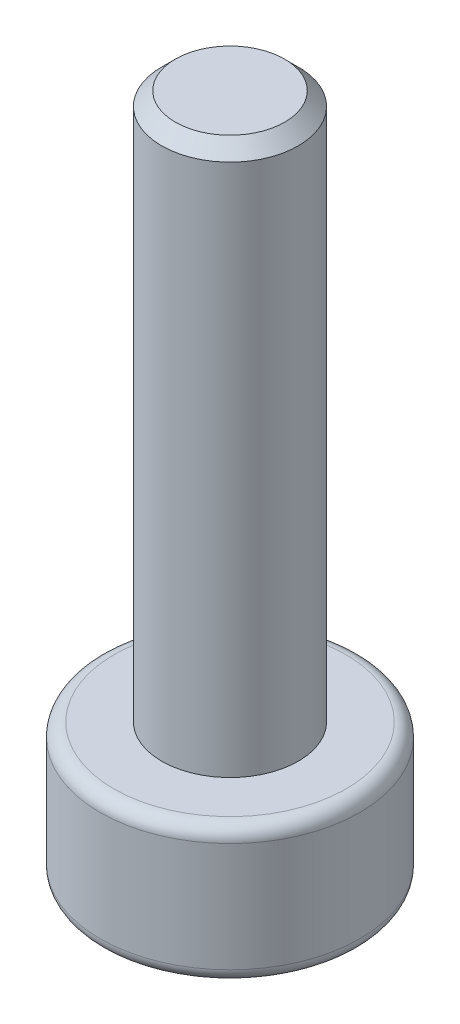
ISO-10303-21;
HEADER;
FILE_DESCRIPTION(('STEP AP214'),'2;1');
FILE_NAME('part.step','',(''),(''),'','','');
FILE_SCHEMA(('AUTOMOTIVE_DESIGN { 1 0 10303 214 1 1 1 1 }'));
ENDSEC;
DATA;
#1=APPLICATION_CONTEXT('core data for automotive mechanical design processes');
#2=APPLICATION_PROTOCOL_DEFINITION('international standard','automotive_design',2000,#1);
#3=PRODUCT_CONTEXT('',#1,'mechanical');
#4=PRODUCT('Part','Part','',(#3));
#5=PRODUCT_RELATED_PRODUCT_CATEGORY('part','',(#4));
#6=PRODUCT_DEFINITION_FORMATION('','',#4);
#7=PRODUCT_DEFINITION_CONTEXT('part definition',#1,'design');
#8=PRODUCT_DEFINITION('design','',#6,#7);
#9=PRODUCT_DEFINITION_SHAPE('','',#8);
#10=(LENGTH_UNIT() NAMED_UNIT(*) SI_UNIT(.MILLI.,.METRE.));
#11=(NAMED_UNIT(*) PLANE_ANGLE_UNIT() SI_UNIT($,.RADIAN.));
#12=(NAMED_UNIT(*) SI_UNIT($,.STERADIAN.) SOLID_ANGLE_UNIT());
#13=UNCERTAINTY_MEASURE_WITH_UNIT(LENGTH_MEASURE(1.E-05),#10,'distance_accuracy_value','');
#14=(GEOMETRIC_REPRESENTATION_CONTEXT(3) GLOBAL_UNCERTAINTY_ASSIGNED_CONTEXT((#13)) GLOBAL_UNIT_ASSIGNED_CONTEXT((#10,
#11,#12)) REPRESENTATION_CONTEXT('',''));
#15=CARTESIAN_POINT('',(0.,0.,0.));
#16=DIRECTION('',(0.,0.,1.));
#17=DIRECTION('',(1.,0.,0.));
#18=AXIS2_PLACEMENT_3D('',#15,#16,#17);
#19=CARTESIAN_POINT('',(0.,3.,0.));
#20=DIRECTION('',(0.,-1.,0.));
#21=DIRECTION('',(0.,0.,-1.));
#22=AXIS2_PLACEMENT_3D('',#19,#20,#21);
#23=CYLINDRICAL_SURFACE('',#22,2.85);
#24=CARTESIAN_POINT('',(0.,2.7,0.));
#25=DIRECTION('',(0.,1.,0.));
#26=DIRECTION('',(0.,0.,1.));
#27=AXIS2_PLACEMENT_3D('',#24,#25,#26);
#28=CIRCLE('',#27,2.85);
#29=CARTESIAN_POINT('',(0.,2.7,2.85));
#30=VERTEX_POINT('',#29);
#31=EDGE_CURVE('E68',#30,#30,#28,.F.);
#32=ORIENTED_EDGE('',*,*,#31,.T.);
#33=EDGE_LOOP('',(#32));
#34=FACE_BOUND('',#33,.T.);
#35=CARTESIAN_POINT('',(0.,0.3,0.));
#36=DIRECTION('',(0.,1.,0.));
#37=DIRECTION('',(0.,0.,1.));
#38=AXIS2_PLACEMENT_3D('',#35,#36,#37);
#39=CIRCLE('',#38,2.85);
#40=CARTESIAN_POINT('',(0.,0.3,2.85));
#41=VERTEX_POINT('',#40);
#42=EDGE_CURVE('E72',#41,#41,#39,.T.);
#43=ORIENTED_EDGE('',*,*,#42,.T.);
#44=EDGE_LOOP('',(#43));
#45=FACE_BOUND('',#44,.T.);
#46=ADVANCED_FACE('F39',(#34,#45),#23,.T.);
#47=CARTESIAN_POINT('',(0.,3.,0.));
#48=DIRECTION('',(0.,1.,0.));
#49=DIRECTION('',(0.,0.,1.));
#50=AXIS2_PLACEMENT_3D('',#47,#48,#49);
#51=PLANE('',#50);
#52=CARTESIAN_POINT('',(0.,3.,0.));
#53=DIRECTION('',(0.,1.,0.));
#54=DIRECTION('',(0.,0.,1.));
#55=AXIS2_PLACEMENT_3D('',#52,#53,#54);
#56=CIRCLE('',#55,2.55);
#57=CARTESIAN_POINT('',(0.,3.,2.55));
#58=VERTEX_POINT('',#57);
#59=EDGE_CURVE('E76',#58,#58,#56,.T.);
#60=ORIENTED_EDGE('',*,*,#59,.T.);
#61=EDGE_LOOP('',(#60));
#62=FACE_BOUND('',#61,.T.);
#63=CARTESIAN_POINT('',(0.,3.,0.));
#64=DIRECTION('',(0.,1.,0.));
#65=DIRECTION('',(0.,0.,1.));
#66=AXIS2_PLACEMENT_3D('',#63,#64,#65);
#67=CIRCLE('',#66,1.5);
#68=CARTESIAN_POINT('',(0.,3.,1.5));
#69=VERTEX_POINT('',#68);
#70=EDGE_CURVE('E80',#69,#69,#67,.T.);
#71=ORIENTED_EDGE('',*,*,#70,.F.);
#72=EDGE_LOOP('',(#71));
#73=FACE_BOUND('',#72,.T.);
#74=ADVANCED_FACE('F105',(#62,#73),#51,.T.);
#75=CARTESIAN_POINT('',(0.,0.,0.));
#76=DIRECTION('',(0.,1.,0.));
#77=DIRECTION('',(0.,0.,1.));
#78=AXIS2_PLACEMENT_3D('',#75,#76,#77);
#79=PLANE('',#78);
#80=CARTESIAN_POINT('',(0.,0.,0.));
#81=DIRECTION('',(0.,1.,0.));
#82=DIRECTION('',(0.,0.,1.));
#83=AXIS2_PLACEMENT_3D('',#80,#81,#82);
#84=CIRCLE('',#83,1.44);
#85=CARTESIAN_POINT('',(0.,0.,1.44));
#86=VERTEX_POINT('',#85);
#87=EDGE_CURVE('E10',#86,#86,#84,.T.);
#88=ORIENTED_EDGE('',*,*,#87,.T.);
#89=EDGE_LOOP('',(#88));
#90=FACE_BOUND('',#89,.T.);
#91=CARTESIAN_POINT('',(0.,0.,0.));
#92=DIRECTION('',(0.,1.,0.));
#93=DIRECTION('',(0.,0.,1.));
#94=AXIS2_PLACEMENT_3D('',#91,#92,#93);
#95=CIRCLE('',#94,2.55);
#96=CARTESIAN_POINT('',(0.,0.,2.55));
#97=VERTEX_POINT('',#96);
#98=EDGE_CURVE('E64',#97,#97,#95,.F.);
#99=ORIENTED_EDGE('',*,*,#98,.T.);
#100=EDGE_LOOP('',(#99));
#101=FACE_BOUND('',#100,.T.);
#102=ADVANCED_FACE('F111',(#90,#101),#79,.F.);
#103=CARTESIAN_POINT('',(0.,15.,0.));
#104=DIRECTION('',(0.,-1.,0.));
#105=DIRECTION('',(0.,0.,-1.));
#106=AXIS2_PLACEMENT_3D('',#103,#104,#105);
#107=CYLINDRICAL_SURFACE('',#106,1.5);
#108=CARTESIAN_POINT('',(0.,14.7,0.));
#109=DIRECTION('',(0.,1.,0.));
#110=DIRECTION('',(0.,0.,1.));
#111=AXIS2_PLACEMENT_3D('',#108,#109,#110);
#112=CIRCLE('',#111,1.5);
#113=CARTESIAN_POINT('',(0.,14.7,1.5));
#114=VERTEX_POINT('',#113);
#115=EDGE_CURVE('E53',#114,#114,#112,.F.);
#116=ORIENTED_EDGE('',*,*,#115,.T.);
#117=EDGE_LOOP('',(#116));
#118=FACE_BOUND('',#117,.T.);
#119=ORIENTED_EDGE('',*,*,#70,.T.);
#120=EDGE_LOOP('',(#119));
#121=FACE_BOUND('',#120,.T.);
#122=ADVANCED_FACE('F101',(#118,#121),#107,.T.);
#123=CARTESIAN_POINT('',(0.,15.,0.));
#124=DIRECTION('',(0.,1.,0.));
#125=DIRECTION('',(0.,0.,1.));
#126=AXIS2_PLACEMENT_3D('',#123,#124,#125);
#127=PLANE('',#126);
#128=CARTESIAN_POINT('',(0.,15.,0.));
#129=DIRECTION('',(0.,1.,0.));
#130=DIRECTION('',(0.,0.,1.));
#131=AXIS2_PLACEMENT_3D('',#128,#129,#130);
#132=CIRCLE('',#131,1.2);
#133=CARTESIAN_POINT('',(0.,15.,1.2));
#134=VERTEX_POINT('',#133);
#135=EDGE_CURVE('E58',#134,#134,#132,.T.);
#136=ORIENTED_EDGE('',*,*,#135,.T.);
#137=EDGE_LOOP('',(#136));
#138=FACE_BOUND('',#137,.T.);
#139=ADVANCED_FACE('F93',(#138),#127,.T.);
#140=CARTESIAN_POINT('',(0.,1.3,0.));
#141=DIRECTION('',(0.,-1.,0.));
#142=DIRECTION('',(0.,0.,-1.));
#143=AXIS2_PLACEMENT_3D('',#140,#141,#142);
#144=CYLINDRICAL_SURFACE('',#143,1.29);
#145=CARTESIAN_POINT('',(0.,0.149999999999998,0.));
#146=DIRECTION('',(0.,1.,0.));
#147=DIRECTION('',(0.,0.,1.));
#148=AXIS2_PLACEMENT_3D('',#145,#146,#147);
#149=CIRCLE('',#148,1.29);
#150=CARTESIAN_POINT('',(0.,0.149999999999998,1.29));
#151=VERTEX_POINT('',#150);
#152=EDGE_CURVE('E48',#151,#151,#149,.F.);
#153=ORIENTED_EDGE('',*,*,#152,.T.);
#154=EDGE_LOOP('',(#153));
#155=FACE_BOUND('',#154,.T.);
#156=CARTESIAN_POINT('',(0.,1.3,0.));
#157=DIRECTION('',(0.,-1.,0.));
#158=DIRECTION('',(0.,0.,-1.));
#159=AXIS2_PLACEMENT_3D('',#156,#157,#158);
#160=CIRCLE('',#159,1.29);
#161=CARTESIAN_POINT('',(0.,1.3,-1.29));
#162=VERTEX_POINT('',#161);
#163=EDGE_CURVE('E84',#162,#162,#160,.T.);
#164=ORIENTED_EDGE('',*,*,#163,.F.);
#165=EDGE_LOOP('',(#164));
#166=FACE_BOUND('',#165,.T.);
#167=ADVANCED_FACE('F91',(#155,#166),#144,.F.);
#168=CARTESIAN_POINT('',(0.,1.3,0.));
#169=DIRECTION('',(0.,-1.,0.));
#170=DIRECTION('',(0.,0.,-1.));
#171=AXIS2_PLACEMENT_3D('',#168,#169,#170);
#172=PLANE('',#171);
#173=ORIENTED_EDGE('',*,*,#163,.T.);
#174=EDGE_LOOP('',(#173));
#175=FACE_BOUND('',#174,.T.);
#176=ADVANCED_FACE('F89',(#175),#172,.T.);
#177=CARTESIAN_POINT('',(0.,2.7,0.));
#178=DIRECTION('',(0.,1.,0.));
#179=DIRECTION('',(0.,0.,1.));
#180=AXIS2_PLACEMENT_3D('',#177,#178,#179);
#181=TOROIDAL_SURFACE('',#180,2.55,0.3);
#182=ORIENTED_EDGE('',*,*,#31,.F.);
#183=EDGE_LOOP('',(#182));
#184=FACE_BOUND('',#183,.T.);
#185=ORIENTED_EDGE('',*,*,#59,.F.);
#186=EDGE_LOOP('',(#185));
#187=FACE_BOUND('',#186,.T.);
#188=ADVANCED_FACE('F99',(#184,#187),#181,.T.);
#189=CARTESIAN_POINT('',(0.,0.3,0.));
#190=DIRECTION('',(0.,1.,0.));
#191=DIRECTION('',(0.,0.,1.));
#192=AXIS2_PLACEMENT_3D('',#189,#190,#191);
#193=TOROIDAL_SURFACE('',#192,2.55,0.3);
#194=ORIENTED_EDGE('',*,*,#98,.F.);
#195=EDGE_LOOP('',(#194));
#196=FACE_BOUND('',#195,.T.);
#197=ORIENTED_EDGE('',*,*,#42,.F.);
#198=EDGE_LOOP('',(#197));
#199=FACE_BOUND('',#198,.T.);
#200=ADVANCED_FACE('F119',(#196,#199),#193,.T.);
#201=CARTESIAN_POINT('',(0.,15.,0.));
#202=DIRECTION('',(0.,-1.,0.));
#203=DIRECTION('',(0.,0.,-1.));
#204=AXIS2_PLACEMENT_3D('',#201,#202,#203);
#205=CONICAL_SURFACE('',#204,1.2,0.785398163397444);
#206=ORIENTED_EDGE('',*,*,#115,.F.);
#207=EDGE_LOOP('',(#206));
#208=FACE_BOUND('',#207,.T.);
#209=ORIENTED_EDGE('',*,*,#135,.F.);
#210=EDGE_LOOP('',(#209));
#211=FACE_BOUND('',#210,.T.);
#212=ADVANCED_FACE('F122',(#208,#211),#205,.T.);
#213=CARTESIAN_POINT('',(0.,0.149999999999998,0.));
#214=DIRECTION('',(0.,-1.,0.));
#215=DIRECTION('',(0.,0.,-1.));
#216=AXIS2_PLACEMENT_3D('',#213,#214,#215);
#217=CONICAL_SURFACE('',#216,1.29,0.78539816339745);
#218=ORIENTED_EDGE('',*,*,#87,.F.);
#219=EDGE_LOOP('',(#218));
#220=FACE_BOUND('',#219,.T.);
#221=ORIENTED_EDGE('',*,*,#152,.F.);
#222=EDGE_LOOP('',(#221));
#223=FACE_BOUND('',#222,.T.);
#224=ADVANCED_FACE('F42',(#220,#223),#217,.F.);
#225=CLOSED_SHELL('',(#46,#74,#102,#122,#139,#167,#176,#188,#200,#212,#224));
#226=MANIFOLD_SOLID_BREP('B2',#225);
#227=ADVANCED_BREP_SHAPE_REPRESENTATION('',(#18,#226),#14);
#228=SHAPE_DEFINITION_REPRESENTATION(#9,#227);
ENDSEC;
END-ISO-10303-21;
